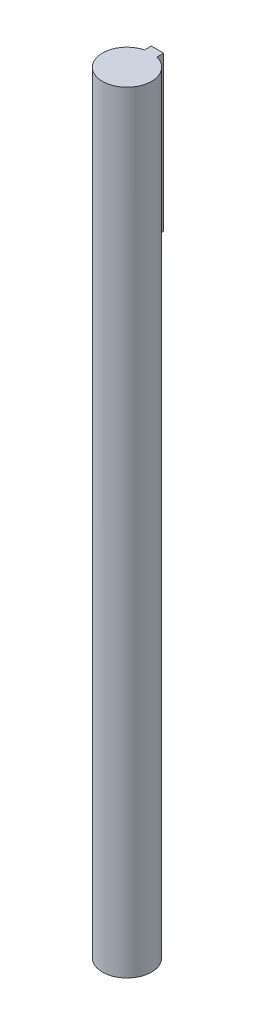
ISO-10303-21;
HEADER;
FILE_DESCRIPTION(('STEP AP214'),'2;1');
FILE_NAME('part.step','',(''),(''),'','','');
FILE_SCHEMA(('AUTOMOTIVE_DESIGN { 1 0 10303 214 1 1 1 1 }'));
ENDSEC;
DATA;
#1=APPLICATION_CONTEXT('core data for automotive mechanical design processes');
#2=APPLICATION_PROTOCOL_DEFINITION('international standard','automotive_design',2000,#1);
#3=PRODUCT_CONTEXT('',#1,'mechanical');
#4=PRODUCT('Part','Part','',(#3));
#5=PRODUCT_RELATED_PRODUCT_CATEGORY('part','',(#4));
#6=PRODUCT_DEFINITION_FORMATION('','',#4);
#7=PRODUCT_DEFINITION_CONTEXT('part definition',#1,'design');
#8=PRODUCT_DEFINITION('design','',#6,#7);
#9=PRODUCT_DEFINITION_SHAPE('','',#8);
#10=(LENGTH_UNIT() NAMED_UNIT(*) SI_UNIT(.MILLI.,.METRE.));
#11=(NAMED_UNIT(*) PLANE_ANGLE_UNIT() SI_UNIT($,.RADIAN.));
#12=(NAMED_UNIT(*) SI_UNIT($,.STERADIAN.) SOLID_ANGLE_UNIT());
#13=UNCERTAINTY_MEASURE_WITH_UNIT(LENGTH_MEASURE(1.E-05),#10,'distance_accuracy_value','');
#14=(GEOMETRIC_REPRESENTATION_CONTEXT(3) GLOBAL_UNCERTAINTY_ASSIGNED_CONTEXT((#13)) GLOBAL_UNIT_ASSIGNED_CONTEXT((#10,
#11,#12)) REPRESENTATION_CONTEXT('',''));
#15=CARTESIAN_POINT('',(0.,0.,0.));
#16=DIRECTION('',(0.,0.,1.));
#17=DIRECTION('',(1.,0.,0.));
#18=AXIS2_PLACEMENT_3D('',#15,#16,#17);
#19=CARTESIAN_POINT('',(0.,300.,0.));
#20=DIRECTION('',(0.,-1.,0.));
#21=DIRECTION('',(0.,0.,-1.));
#22=AXIS2_PLACEMENT_3D('',#19,#20,#21);
#23=CYLINDRICAL_SURFACE('',#22,9.54);
#24=CARTESIAN_POINT('',(0.,240.,0.));
#25=DIRECTION('',(0.,-1.,0.));
#26=DIRECTION('',(0.,0.,1.));
#27=AXIS2_PLACEMENT_3D('',#24,#25,#26);
#28=CIRCLE('',#27,9.54);
#29=CARTESIAN_POINT('',(-2.4,240.,-9.23317930076093));
#30=VERTEX_POINT('',#29);
#31=CARTESIAN_POINT('',(2.4,240.,-9.23317930076092));
#32=VERTEX_POINT('',#31);
#33=EDGE_CURVE('E97',#30,#32,#28,.T.);
#34=ORIENTED_EDGE('',*,*,#33,.T.);
#35=DIRECTION('',(0.,1.,0.));
#36=VECTOR('',#35,1.);
#37=CARTESIAN_POINT('',(2.4,240.,-9.23317930076092));
#38=LINE('',#37,#36);
#39=CARTESIAN_POINT('',(2.4,300.,-9.23317930076092));
#40=VERTEX_POINT('',#39);
#41=EDGE_CURVE('E61',#32,#40,#38,.T.);
#42=ORIENTED_EDGE('',*,*,#41,.T.);
#43=CARTESIAN_POINT('',(0.,300.,0.));
#44=DIRECTION('',(0.,1.,0.));
#45=DIRECTION('',(0.,0.,1.));
#46=AXIS2_PLACEMENT_3D('',#43,#44,#45);
#47=CIRCLE('',#46,9.54);
#48=CARTESIAN_POINT('',(-2.4,300.,-9.23317930076093));
#49=VERTEX_POINT('',#48);
#50=EDGE_CURVE('E11',#49,#40,#47,.T.);
#51=ORIENTED_EDGE('',*,*,#50,.F.);
#52=DIRECTION('',(0.,1.,0.));
#53=VECTOR('',#52,1.);
#54=CARTESIAN_POINT('',(-2.4,240.,-9.23317930076093));
#55=LINE('',#54,#53);
#56=EDGE_CURVE('E91',#30,#49,#55,.T.);
#57=ORIENTED_EDGE('',*,*,#56,.F.);
#58=EDGE_LOOP('',(#34,#42,#51,#57));
#59=FACE_BOUND('',#58,.T.);
#60=CARTESIAN_POINT('',(0.,0.,0.));
#61=DIRECTION('',(0.,1.,0.));
#62=DIRECTION('',(0.,0.,1.));
#63=AXIS2_PLACEMENT_3D('',#60,#61,#62);
#64=CIRCLE('',#63,9.54);
#65=CARTESIAN_POINT('',(0.,0.,9.54));
#66=VERTEX_POINT('',#65);
#67=EDGE_CURVE('E42',#66,#66,#64,.T.);
#68=ORIENTED_EDGE('',*,*,#67,.T.);
#69=EDGE_LOOP('',(#68));
#70=FACE_BOUND('',#69,.T.);
#71=ADVANCED_FACE('F39',(#59,#70),#23,.T.);
#72=CARTESIAN_POINT('',(0.,300.,0.));
#73=DIRECTION('',(0.,1.,0.));
#74=DIRECTION('',(0.,0.,1.));
#75=AXIS2_PLACEMENT_3D('',#72,#73,#74);
#76=PLANE('',#75);
#77=ORIENTED_EDGE('',*,*,#50,.T.);
#78=DIRECTION('',(0.,0.,-1.));
#79=VECTOR('',#78,1.);
#80=CARTESIAN_POINT('',(2.4,300.,-9.23317930076092));
#81=LINE('',#80,#79);
#82=CARTESIAN_POINT('',(2.4,300.,-11.87));
#83=VERTEX_POINT('',#82);
#84=EDGE_CURVE('E76',#40,#83,#81,.T.);
#85=ORIENTED_EDGE('',*,*,#84,.T.);
#86=DIRECTION('',(-1.,0.,0.));
#87=VECTOR('',#86,1.);
#88=CARTESIAN_POINT('',(-2.4,300.,-11.87));
#89=LINE('',#88,#87);
#90=CARTESIAN_POINT('',(-2.4,300.,-11.87));
#91=VERTEX_POINT('',#90);
#92=EDGE_CURVE('E107',#83,#91,#89,.T.);
#93=ORIENTED_EDGE('',*,*,#92,.T.);
#94=DIRECTION('',(0.,0.,1.));
#95=VECTOR('',#94,1.);
#96=CARTESIAN_POINT('',(-2.4,300.,-9.23317930076093));
#97=LINE('',#96,#95);
#98=EDGE_CURVE('E52',#91,#49,#97,.T.);
#99=ORIENTED_EDGE('',*,*,#98,.T.);
#100=EDGE_LOOP('',(#77,#85,#93,#99));
#101=FACE_BOUND('',#100,.T.);
#102=ADVANCED_FACE('F113',(#101),#76,.T.);
#103=CARTESIAN_POINT('',(0.,0.,0.));
#104=DIRECTION('',(0.,1.,0.));
#105=DIRECTION('',(0.,0.,1.));
#106=AXIS2_PLACEMENT_3D('',#103,#104,#105);
#107=PLANE('',#106);
#108=ORIENTED_EDGE('',*,*,#67,.F.);
#109=EDGE_LOOP('',(#108));
#110=FACE_BOUND('',#109,.T.);
#111=ADVANCED_FACE('F121',(#110),#107,.F.);
#112=CARTESIAN_POINT('',(2.4,240.,-9.23317930076092));
#113=DIRECTION('',(1.,0.,0.));
#114=DIRECTION('',(0.,0.,-1.));
#115=AXIS2_PLACEMENT_3D('',#112,#113,#114);
#116=PLANE('',#115);
#117=ORIENTED_EDGE('',*,*,#84,.F.);
#118=ORIENTED_EDGE('',*,*,#41,.F.);
#119=DIRECTION('',(0.,0.,-1.));
#120=VECTOR('',#119,1.);
#121=CARTESIAN_POINT('',(2.4,240.,-9.23317930076092));
#122=LINE('',#121,#120);
#123=CARTESIAN_POINT('',(2.4,240.,-11.87));
#124=VERTEX_POINT('',#123);
#125=EDGE_CURVE('E101',#32,#124,#122,.T.);
#126=ORIENTED_EDGE('',*,*,#125,.T.);
#127=DIRECTION('',(0.,1.,0.));
#128=VECTOR('',#127,1.);
#129=CARTESIAN_POINT('',(2.4,240.,-11.87));
#130=LINE('',#129,#128);
#131=EDGE_CURVE('E82',#124,#83,#130,.T.);
#132=ORIENTED_EDGE('',*,*,#131,.T.);
#133=EDGE_LOOP('',(#117,#118,#126,#132));
#134=FACE_BOUND('',#133,.T.);
#135=ADVANCED_FACE('F112',(#134),#116,.T.);
#136=CARTESIAN_POINT('',(-2.4,240.,-9.23317930076093));
#137=DIRECTION('',(-1.,0.,0.));
#138=DIRECTION('',(0.,0.,1.));
#139=AXIS2_PLACEMENT_3D('',#136,#137,#138);
#140=PLANE('',#139);
#141=ORIENTED_EDGE('',*,*,#98,.F.);
#142=DIRECTION('',(0.,1.,0.));
#143=VECTOR('',#142,1.);
#144=CARTESIAN_POINT('',(-2.4,240.,-11.87));
#145=LINE('',#144,#143);
#146=CARTESIAN_POINT('',(-2.4,240.,-11.87));
#147=VERTEX_POINT('',#146);
#148=EDGE_CURVE('E86',#147,#91,#145,.T.);
#149=ORIENTED_EDGE('',*,*,#148,.F.);
#150=DIRECTION('',(0.,0.,1.));
#151=VECTOR('',#150,1.);
#152=CARTESIAN_POINT('',(-2.4,240.,-9.23317930076093));
#153=LINE('',#152,#151);
#154=EDGE_CURVE('E89',#147,#30,#153,.T.);
#155=ORIENTED_EDGE('',*,*,#154,.T.);
#156=ORIENTED_EDGE('',*,*,#56,.T.);
#157=EDGE_LOOP('',(#141,#149,#155,#156));
#158=FACE_BOUND('',#157,.T.);
#159=ADVANCED_FACE('F88',(#158),#140,.T.);
#160=CARTESIAN_POINT('',(-2.4,240.,-11.87));
#161=DIRECTION('',(0.,0.,-1.));
#162=DIRECTION('',(-1.,0.,0.));
#163=AXIS2_PLACEMENT_3D('',#160,#161,#162);
#164=PLANE('',#163);
#165=ORIENTED_EDGE('',*,*,#92,.F.);
#166=ORIENTED_EDGE('',*,*,#131,.F.);
#167=DIRECTION('',(-1.,0.,0.));
#168=VECTOR('',#167,1.);
#169=CARTESIAN_POINT('',(-2.4,240.,-11.87));
#170=LINE('',#169,#168);
#171=EDGE_CURVE('E95',#124,#147,#170,.T.);
#172=ORIENTED_EDGE('',*,*,#171,.T.);
#173=ORIENTED_EDGE('',*,*,#148,.T.);
#174=EDGE_LOOP('',(#165,#166,#172,#173));
#175=FACE_BOUND('',#174,.T.);
#176=ADVANCED_FACE('F100',(#175),#164,.T.);
#177=CARTESIAN_POINT('',(0.,240.,0.));
#178=DIRECTION('',(0.,1.,0.));
#179=DIRECTION('',(0.,0.,1.));
#180=AXIS2_PLACEMENT_3D('',#177,#178,#179);
#181=PLANE('',#180);
#182=ORIENTED_EDGE('',*,*,#125,.F.);
#183=ORIENTED_EDGE('',*,*,#33,.F.);
#184=ORIENTED_EDGE('',*,*,#154,.F.);
#185=ORIENTED_EDGE('',*,*,#171,.F.);
#186=EDGE_LOOP('',(#182,#183,#184,#185));
#187=FACE_BOUND('',#186,.T.);
#188=ADVANCED_FACE('F94',(#187),#181,.F.);
#189=CLOSED_SHELL('',(#71,#102,#111,#135,#159,#176,#188));
#190=MANIFOLD_SOLID_BREP('B2',#189);
#191=ADVANCED_BREP_SHAPE_REPRESENTATION('',(#18,#190),#14);
#192=SHAPE_DEFINITION_REPRESENTATION(#9,#191);
ENDSEC;
END-ISO-10303-21;
